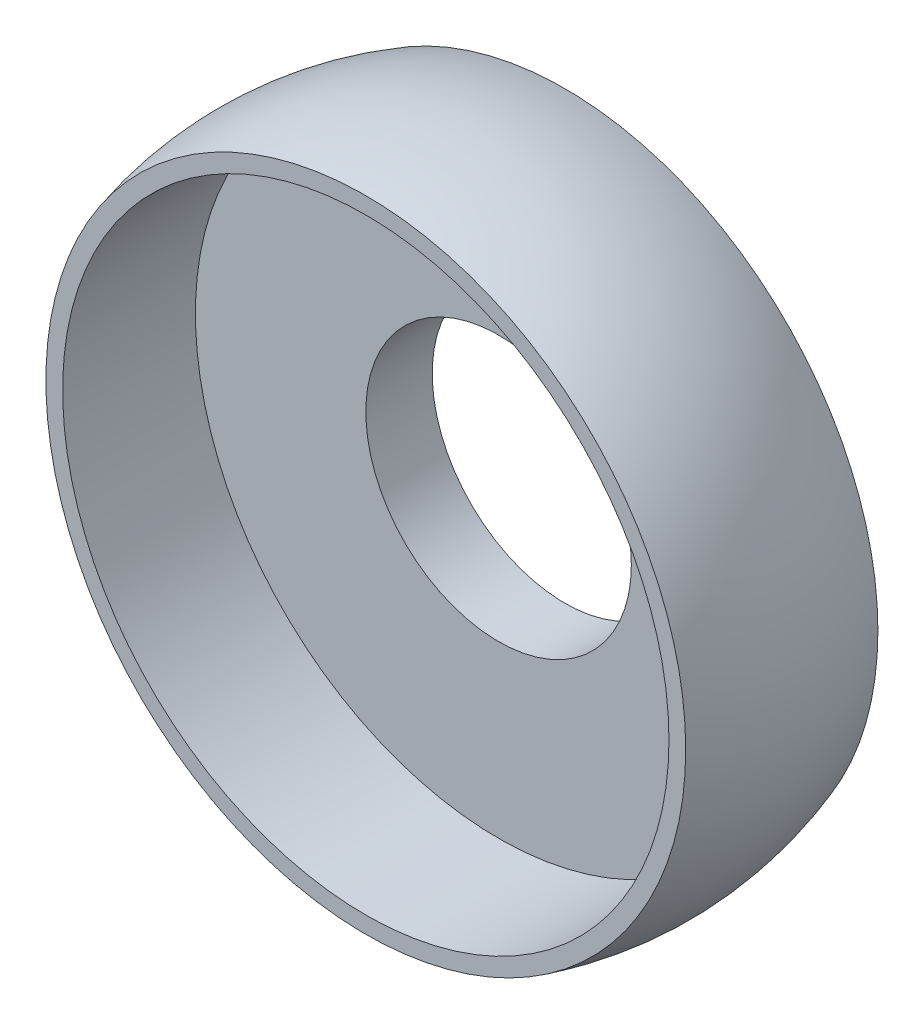
ISO-10303-21;
HEADER;
FILE_DESCRIPTION(('STEP AP214'),'2;1');
FILE_NAME('part.step','',(''),(''),'','','');
FILE_SCHEMA(('AUTOMOTIVE_DESIGN { 1 0 10303 214 1 1 1 1 }'));
ENDSEC;
DATA;
#1=APPLICATION_CONTEXT('core data for automotive mechanical design processes');
#2=APPLICATION_PROTOCOL_DEFINITION('international standard','automotive_design',2000,#1);
#3=PRODUCT_CONTEXT('',#1,'mechanical');
#4=PRODUCT('Part','Part','',(#3));
#5=PRODUCT_RELATED_PRODUCT_CATEGORY('part','',(#4));
#6=PRODUCT_DEFINITION_FORMATION('','',#4);
#7=PRODUCT_DEFINITION_CONTEXT('part definition',#1,'design');
#8=PRODUCT_DEFINITION('design','',#6,#7);
#9=PRODUCT_DEFINITION_SHAPE('','',#8);
#10=(LENGTH_UNIT() NAMED_UNIT(*) SI_UNIT(.MILLI.,.METRE.));
#11=(NAMED_UNIT(*) PLANE_ANGLE_UNIT() SI_UNIT($,.RADIAN.));
#12=(NAMED_UNIT(*) SI_UNIT($,.STERADIAN.) SOLID_ANGLE_UNIT());
#13=UNCERTAINTY_MEASURE_WITH_UNIT(LENGTH_MEASURE(1.E-05),#10,'distance_accuracy_value','');
#14=(GEOMETRIC_REPRESENTATION_CONTEXT(3) GLOBAL_UNCERTAINTY_ASSIGNED_CONTEXT((#13)) GLOBAL_UNIT_ASSIGNED_CONTEXT((#10,
#11,#12)) REPRESENTATION_CONTEXT('',''));
#15=CARTESIAN_POINT('',(0.,0.,0.));
#16=DIRECTION('',(0.,0.,1.));
#17=DIRECTION('',(1.,0.,0.));
#18=AXIS2_PLACEMENT_3D('',#15,#16,#17);
#19=CARTESIAN_POINT('',(0.,0.,0.));
#20=DIRECTION('',(-1.,0.,0.));
#21=DIRECTION('',(0.,1.,0.));
#22=AXIS2_PLACEMENT_3D('',#19,#20,#21);
#23=SPHERICAL_SURFACE('',#22,7.5);
#24=CARTESIAN_POINT('',(0.,0.,0.));
#25=DIRECTION('',(0.,0.,1.));
#26=DIRECTION('',(1.,0.,0.));
#27=AXIS2_PLACEMENT_3D('',#24,#25,#26);
#28=SPHERICAL_SURFACE('',#27,7.5);
#29=CARTESIAN_POINT('',(0.,0.,-2.5));
#30=DIRECTION('',(0.,0.,1.));
#31=DIRECTION('',(1.,0.,0.));
#32=AXIS2_PLACEMENT_3D('',#29,#30,#31);
#33=CIRCLE('',#32,7.07106781186548);
#34=CARTESIAN_POINT('',(7.07106781186548,0.,-2.5));
#35=VERTEX_POINT('',#34);
#36=EDGE_CURVE('E50',#35,#35,#33,.T.);
#37=ORIENTED_EDGE('',*,*,#36,.T.);
#38=EDGE_LOOP('',(#37));
#39=FACE_BOUND('',#38,.T.);
#40=CARTESIAN_POINT('',(0.,0.,2.));
#41=DIRECTION('',(0.,0.,1.));
#42=DIRECTION('',(1.,0.,0.));
#43=AXIS2_PLACEMENT_3D('',#40,#41,#42);
#44=CIRCLE('',#43,7.22841614740048);
#45=CARTESIAN_POINT('',(7.22841614740048,0.,2.));
#46=VERTEX_POINT('',#45);
#47=EDGE_CURVE('E10',#46,#46,#44,.T.);
#48=ORIENTED_EDGE('',*,*,#47,.F.);
#49=EDGE_LOOP('',(#48));
#50=FACE_BOUND('',#49,.T.);
#51=ADVANCED_FACE('F33',(#39,#50),#28,.T.);
#52=CARTESIAN_POINT('',(0.,0.,2.));
#53=DIRECTION('',(0.,0.,1.));
#54=DIRECTION('',(1.,0.,0.));
#55=AXIS2_PLACEMENT_3D('',#52,#53,#54);
#56=PLANE('',#55);
#57=CARTESIAN_POINT('',(0.,0.,2.));
#58=DIRECTION('',(0.,0.,1.));
#59=DIRECTION('',(1.,0.,0.));
#60=AXIS2_PLACEMENT_3D('',#57,#58,#59);
#61=CIRCLE('',#60,6.85);
#62=CARTESIAN_POINT('',(6.85,0.,2.));
#63=VERTEX_POINT('',#62);
#64=EDGE_CURVE('E45',#63,#63,#61,.T.);
#65=ORIENTED_EDGE('',*,*,#64,.F.);
#66=EDGE_LOOP('',(#65));
#67=FACE_BOUND('',#66,.T.);
#68=ORIENTED_EDGE('',*,*,#47,.T.);
#69=EDGE_LOOP('',(#68));
#70=FACE_BOUND('',#69,.T.);
#71=ADVANCED_FACE('F73',(#67,#70),#56,.T.);
#72=CARTESIAN_POINT('',(0.,0.,-1.));
#73=DIRECTION('',(0.,0.,1.));
#74=DIRECTION('',(1.,0.,0.));
#75=AXIS2_PLACEMENT_3D('',#72,#73,#74);
#76=CYLINDRICAL_SURFACE('',#75,6.85);
#77=CARTESIAN_POINT('',(0.,0.,-1.));
#78=DIRECTION('',(0.,0.,1.));
#79=DIRECTION('',(1.,0.,0.));
#80=AXIS2_PLACEMENT_3D('',#77,#78,#79);
#81=CIRCLE('',#80,6.85);
#82=CARTESIAN_POINT('',(6.85,0.,-1.));
#83=VERTEX_POINT('',#82);
#84=EDGE_CURVE('E40',#83,#83,#81,.T.);
#85=ORIENTED_EDGE('',*,*,#84,.F.);
#86=EDGE_LOOP('',(#85));
#87=FACE_BOUND('',#86,.T.);
#88=ORIENTED_EDGE('',*,*,#64,.T.);
#89=EDGE_LOOP('',(#88));
#90=FACE_BOUND('',#89,.T.);
#91=ADVANCED_FACE('F77',(#87,#90),#76,.F.);
#92=CARTESIAN_POINT('',(0.,0.,-1.));
#93=DIRECTION('',(0.,0.,1.));
#94=DIRECTION('',(1.,0.,0.));
#95=AXIS2_PLACEMENT_3D('',#92,#93,#94);
#96=PLANE('',#95);
#97=CARTESIAN_POINT('',(0.,0.,-1.));
#98=DIRECTION('',(0.,0.,1.));
#99=DIRECTION('',(1.,0.,0.));
#100=AXIS2_PLACEMENT_3D('',#97,#98,#99);
#101=CIRCLE('',#100,3.);
#102=CARTESIAN_POINT('',(3.,0.,-1.));
#103=VERTEX_POINT('',#102);
#104=EDGE_CURVE('E48',#103,#103,#101,.T.);
#105=ORIENTED_EDGE('',*,*,#104,.F.);
#106=EDGE_LOOP('',(#105));
#107=FACE_BOUND('',#106,.T.);
#108=ORIENTED_EDGE('',*,*,#84,.T.);
#109=EDGE_LOOP('',(#108));
#110=FACE_BOUND('',#109,.T.);
#111=ADVANCED_FACE('F70',(#107,#110),#96,.T.);
#112=CARTESIAN_POINT('',(0.,0.,-7.5));
#113=DIRECTION('',(0.,0.,1.));
#114=DIRECTION('',(1.,0.,0.));
#115=AXIS2_PLACEMENT_3D('',#112,#113,#114);
#116=CYLINDRICAL_SURFACE('',#115,3.);
#117=CARTESIAN_POINT('',(0.,0.,-2.5));
#118=DIRECTION('',(0.,0.,1.));
#119=DIRECTION('',(1.,0.,0.));
#120=AXIS2_PLACEMENT_3D('',#117,#118,#119);
#121=CIRCLE('',#120,3.);
#122=CARTESIAN_POINT('',(3.,0.,-2.5));
#123=VERTEX_POINT('',#122);
#124=EDGE_CURVE('E36',#123,#123,#121,.F.);
#125=CARTESIAN_POINT('',(3.,0.,-2.5));
#126=CARTESIAN_POINT('',(3.,0.,-2.484375));
#127=CARTESIAN_POINT('',(3.,0.,-2.46875));
#128=CARTESIAN_POINT('',(3.,0.,-2.4375));
#129=CARTESIAN_POINT('',(3.,0.,-2.421875));
#130=CARTESIAN_POINT('',(3.,0.,-2.390625));
#131=CARTESIAN_POINT('',(3.,0.,-2.375));
#132=CARTESIAN_POINT('',(3.,0.,-2.34375));
#133=CARTESIAN_POINT('',(3.,0.,-2.328125));
#134=CARTESIAN_POINT('',(3.,0.,-2.296875));
#135=CARTESIAN_POINT('',(3.,0.,-2.28125));
#136=CARTESIAN_POINT('',(3.,0.,-2.25));
#137=CARTESIAN_POINT('',(3.,0.,-2.234375));
#138=CARTESIAN_POINT('',(3.,0.,-2.203125));
#139=CARTESIAN_POINT('',(3.,0.,-2.1875));
#140=CARTESIAN_POINT('',(3.,0.,-2.15625));
#141=CARTESIAN_POINT('',(3.,0.,-2.140625));
#142=CARTESIAN_POINT('',(3.,0.,-2.109375));
#143=CARTESIAN_POINT('',(3.,0.,-2.09375));
#144=CARTESIAN_POINT('',(3.,0.,-2.0625));
#145=CARTESIAN_POINT('',(3.,0.,-2.046875));
#146=CARTESIAN_POINT('',(3.,0.,-2.015625));
#147=CARTESIAN_POINT('',(3.,0.,-2.));
#148=CARTESIAN_POINT('',(3.,0.,-1.96875));
#149=CARTESIAN_POINT('',(3.,0.,-1.953125));
#150=CARTESIAN_POINT('',(3.,0.,-1.921875));
#151=CARTESIAN_POINT('',(3.,0.,-1.90625));
#152=CARTESIAN_POINT('',(3.,0.,-1.875));
#153=CARTESIAN_POINT('',(3.,0.,-1.859375));
#154=CARTESIAN_POINT('',(3.,0.,-1.828125));
#155=CARTESIAN_POINT('',(3.,0.,-1.8125));
#156=CARTESIAN_POINT('',(3.,0.,-1.78125));
#157=CARTESIAN_POINT('',(3.,0.,-1.765625));
#158=CARTESIAN_POINT('',(3.,0.,-1.734375));
#159=CARTESIAN_POINT('',(3.,0.,-1.71875));
#160=CARTESIAN_POINT('',(3.,0.,-1.6875));
#161=CARTESIAN_POINT('',(3.,0.,-1.671875));
#162=CARTESIAN_POINT('',(3.,0.,-1.640625));
#163=CARTESIAN_POINT('',(3.,0.,-1.625));
#164=CARTESIAN_POINT('',(3.,0.,-1.59375));
#165=CARTESIAN_POINT('',(3.,0.,-1.578125));
#166=CARTESIAN_POINT('',(3.,0.,-1.546875));
#167=CARTESIAN_POINT('',(3.,0.,-1.53125));
#168=CARTESIAN_POINT('',(3.,0.,-1.5));
#169=CARTESIAN_POINT('',(3.,0.,-1.484375));
#170=CARTESIAN_POINT('',(3.,0.,-1.453125));
#171=CARTESIAN_POINT('',(3.,0.,-1.4375));
#172=CARTESIAN_POINT('',(3.,0.,-1.40625));
#173=CARTESIAN_POINT('',(3.,0.,-1.390625));
#174=CARTESIAN_POINT('',(3.,0.,-1.359375));
#175=CARTESIAN_POINT('',(3.,0.,-1.34375));
#176=CARTESIAN_POINT('',(3.,0.,-1.3125));
#177=CARTESIAN_POINT('',(3.,0.,-1.296875));
#178=CARTESIAN_POINT('',(3.,0.,-1.265625));
#179=CARTESIAN_POINT('',(3.,0.,-1.25));
#180=CARTESIAN_POINT('',(3.,0.,-1.21875));
#181=CARTESIAN_POINT('',(3.,0.,-1.203125));
#182=CARTESIAN_POINT('',(3.,0.,-1.171875));
#183=CARTESIAN_POINT('',(3.,0.,-1.15625));
#184=CARTESIAN_POINT('',(3.,0.,-1.125));
#185=CARTESIAN_POINT('',(3.,0.,-1.109375));
#186=CARTESIAN_POINT('',(3.,0.,-1.078125));
#187=CARTESIAN_POINT('',(3.,0.,-1.0625));
#188=CARTESIAN_POINT('',(3.,0.,-1.03125));
#189=CARTESIAN_POINT('',(3.,0.,-1.015625));
#190=CARTESIAN_POINT('',(3.,0.,-1.));
#191=B_SPLINE_CURVE_WITH_KNOTS('',3,(#125,#126,#127,#128,#129,#130,#131,#132,#133,#134,#135,
#136,#137,#138,#139,#140,#141,#142,#143,#144,#145,#146,#147,#148,#149,#150,#151,#152,#153,#154,
#155,#156,#157,#158,#159,#160,#161,#162,#163,#164,#165,#166,#167,#168,#169,#170,#171,#172,#173,
#174,#175,#176,#177,#178,#179,#180,#181,#182,#183,#184,#185,#186,#187,#188,#189,#190),
.UNSPECIFIED.,.F.,.F.,(4,2,2,2,2,2,2,2,2,2,2,2,2,2,2,2,2,2,2,2,2,2,2,2,2,2,2,2,2,2,2,2,4),(0.,
0.046875,0.0937500000000001,0.140625,0.1875,0.234375,0.28125,0.328125,0.375,0.421875,0.46875,
0.515625,0.5625,0.609375000000001,0.656250000000001,0.703125000000001,0.750000000000001,
0.796875000000001,0.843750000000001,0.890625000000001,0.937500000000001,0.984375000000001,
1.03125,1.078125,1.125,1.171875,1.21875,1.265625,1.3125,1.359375,1.40625,1.453125,1.5),.UNSPECIFIED.);
#192=EDGE_CURVE('BSEAM61',#123,#103,#191,.T.);
#193=ORIENTED_EDGE('',*,*,#124,.T.);
#194=ORIENTED_EDGE('',*,*,#104,.T.);
#195=ORIENTED_EDGE('',*,*,#192,.T.);
#196=ORIENTED_EDGE('',*,*,#192,.F.);
#197=EDGE_LOOP('',(#193,#195,#194,#196));
#198=FACE_BOUND('',#197,.T.);
#199=ADVANCED_FACE('F61',(#198),#116,.F.);
#200=CARTESIAN_POINT('',(0.,0.,-2.5));
#201=DIRECTION('',(0.,0.,1.));
#202=DIRECTION('',(1.,0.,0.));
#203=AXIS2_PLACEMENT_3D('',#200,#201,#202);
#204=PLANE('',#203);
#205=ORIENTED_EDGE('',*,*,#124,.F.);
#206=EDGE_LOOP('',(#205));
#207=FACE_BOUND('',#206,.T.);
#208=ORIENTED_EDGE('',*,*,#36,.F.);
#209=EDGE_LOOP('',(#208));
#210=FACE_BOUND('',#209,.T.);
#211=ADVANCED_FACE('F63',(#207,#210),#204,.F.);
#212=CLOSED_SHELL('',(#51,#71,#91,#111,#199,#211));
#213=MANIFOLD_SOLID_BREP('B2',#212);
#214=ADVANCED_BREP_SHAPE_REPRESENTATION('',(#18,#213),#14);
#215=SHAPE_DEFINITION_REPRESENTATION(#9,#214);
ENDSEC;
END-ISO-10303-21;
